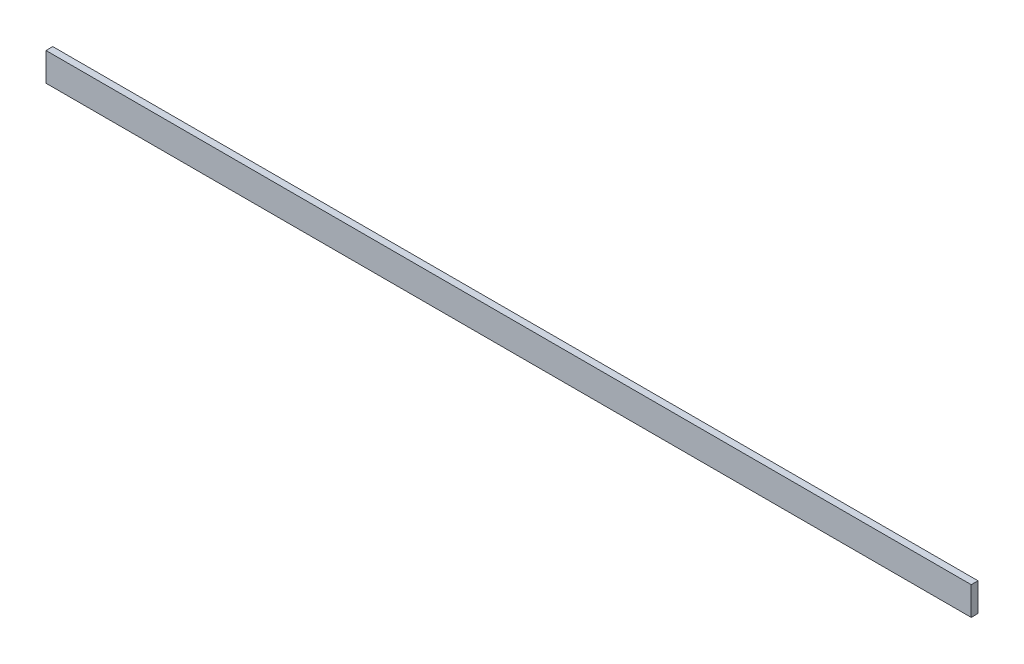
ISO-10303-21;
HEADER;
FILE_DESCRIPTION(('STEP AP214'),'2;1');
FILE_NAME('part.step','',(''),(''),'','','');
FILE_SCHEMA(('AUTOMOTIVE_DESIGN { 1 0 10303 214 1 1 1 1 }'));
ENDSEC;
DATA;
#1=APPLICATION_CONTEXT('core data for automotive mechanical design processes');
#2=APPLICATION_PROTOCOL_DEFINITION('international standard','automotive_design',2000,#1);
#3=PRODUCT_CONTEXT('',#1,'mechanical');
#4=PRODUCT('Part','Part','',(#3));
#5=PRODUCT_RELATED_PRODUCT_CATEGORY('part','',(#4));
#6=PRODUCT_DEFINITION_FORMATION('','',#4);
#7=PRODUCT_DEFINITION_CONTEXT('part definition',#1,'design');
#8=PRODUCT_DEFINITION('design','',#6,#7);
#9=PRODUCT_DEFINITION_SHAPE('','',#8);
#10=(LENGTH_UNIT() NAMED_UNIT(*) SI_UNIT(.MILLI.,.METRE.));
#11=(NAMED_UNIT(*) PLANE_ANGLE_UNIT() SI_UNIT($,.RADIAN.));
#12=(NAMED_UNIT(*) SI_UNIT($,.STERADIAN.) SOLID_ANGLE_UNIT());
#13=UNCERTAINTY_MEASURE_WITH_UNIT(LENGTH_MEASURE(1.E-05),#10,'distance_accuracy_value','');
#14=(GEOMETRIC_REPRESENTATION_CONTEXT(3) GLOBAL_UNCERTAINTY_ASSIGNED_CONTEXT((#13)) GLOBAL_UNIT_ASSIGNED_CONTEXT((#10,
#11,#12)) REPRESENTATION_CONTEXT('',''));
#15=CARTESIAN_POINT('',(0.,0.,0.));
#16=DIRECTION('',(0.,0.,1.));
#17=DIRECTION('',(1.,0.,0.));
#18=AXIS2_PLACEMENT_3D('',#15,#16,#17);
#19=CARTESIAN_POINT('',(3000.,92.,0.));
#20=DIRECTION('',(0.,1.,0.));
#21=DIRECTION('',(1.,0.,0.));
#22=AXIS2_PLACEMENT_3D('',#19,#20,#21);
#23=PLANE('',#22);
#24=DIRECTION('',(-1.,0.,0.));
#25=VECTOR('',#24,1.);
#26=CARTESIAN_POINT('',(3000.,92.,0.));
#27=LINE('',#26,#25);
#28=CARTESIAN_POINT('',(3000.,92.,0.));
#29=VERTEX_POINT('',#28);
#30=CARTESIAN_POINT('',(0.,92.,0.));
#31=VERTEX_POINT('',#30);
#32=EDGE_CURVE('E11',#29,#31,#27,.T.);
#33=ORIENTED_EDGE('',*,*,#32,.T.);
#34=DIRECTION('',(0.,0.,1.));
#35=VECTOR('',#34,1.);
#36=CARTESIAN_POINT('',(0.,92.,0.));
#37=LINE('',#36,#35);
#38=CARTESIAN_POINT('',(0.,92.,22.));
#39=VERTEX_POINT('',#38);
#40=EDGE_CURVE('E27',#31,#39,#37,.T.);
#41=ORIENTED_EDGE('',*,*,#40,.T.);
#42=DIRECTION('',(-1.,0.,0.));
#43=VECTOR('',#42,1.);
#44=CARTESIAN_POINT('',(3000.,92.,22.));
#45=LINE('',#44,#43);
#46=CARTESIAN_POINT('',(3000.,92.,22.));
#47=VERTEX_POINT('',#46);
#48=EDGE_CURVE('E106',#47,#39,#45,.T.);
#49=ORIENTED_EDGE('',*,*,#48,.F.);
#50=DIRECTION('',(0.,0.,1.));
#51=VECTOR('',#50,1.);
#52=CARTESIAN_POINT('',(3000.,92.,0.));
#53=LINE('',#52,#51);
#54=EDGE_CURVE('E90',#29,#47,#53,.T.);
#55=ORIENTED_EDGE('',*,*,#54,.F.);
#56=EDGE_LOOP('',(#33,#41,#49,#55));
#57=FACE_BOUND('',#56,.T.);
#58=ADVANCED_FACE('F16',(#57),#23,.T.);
#59=CARTESIAN_POINT('',(3000.,0.,0.));
#60=DIRECTION('',(1.,0.,0.));
#61=DIRECTION('',(0.,1.,0.));
#62=AXIS2_PLACEMENT_3D('',#59,#60,#61);
#63=PLANE('',#62);
#64=DIRECTION('',(0.,1.,0.));
#65=VECTOR('',#64,1.);
#66=CARTESIAN_POINT('',(3000.,0.,0.));
#67=LINE('',#66,#65);
#68=CARTESIAN_POINT('',(3000.,0.,0.));
#69=VERTEX_POINT('',#68);
#70=EDGE_CURVE('E78',#69,#29,#67,.T.);
#71=ORIENTED_EDGE('',*,*,#70,.T.);
#72=ORIENTED_EDGE('',*,*,#54,.T.);
#73=DIRECTION('',(0.,1.,0.));
#74=VECTOR('',#73,1.);
#75=CARTESIAN_POINT('',(3000.,0.,22.));
#76=LINE('',#75,#74);
#77=CARTESIAN_POINT('',(3000.,0.,22.));
#78=VERTEX_POINT('',#77);
#79=EDGE_CURVE('E80',#78,#47,#76,.T.);
#80=ORIENTED_EDGE('',*,*,#79,.F.);
#81=DIRECTION('',(0.,0.,1.));
#82=VECTOR('',#81,1.);
#83=CARTESIAN_POINT('',(3000.,0.,0.));
#84=LINE('',#83,#82);
#85=EDGE_CURVE('E74',#69,#78,#84,.T.);
#86=ORIENTED_EDGE('',*,*,#85,.F.);
#87=EDGE_LOOP('',(#71,#72,#80,#86));
#88=FACE_BOUND('',#87,.T.);
#89=ADVANCED_FACE('F76',(#88),#63,.T.);
#90=CARTESIAN_POINT('',(0.,0.,0.));
#91=DIRECTION('',(0.,-1.,0.));
#92=DIRECTION('',(0.,0.,-1.));
#93=AXIS2_PLACEMENT_3D('',#90,#91,#92);
#94=PLANE('',#93);
#95=DIRECTION('',(1.,0.,0.));
#96=VECTOR('',#95,1.);
#97=CARTESIAN_POINT('',(0.,0.,0.));
#98=LINE('',#97,#96);
#99=CARTESIAN_POINT('',(0.,0.,0.));
#100=VERTEX_POINT('',#99);
#101=EDGE_CURVE('E83',#100,#69,#98,.T.);
#102=ORIENTED_EDGE('',*,*,#101,.T.);
#103=ORIENTED_EDGE('',*,*,#85,.T.);
#104=DIRECTION('',(1.,0.,0.));
#105=VECTOR('',#104,1.);
#106=CARTESIAN_POINT('',(0.,0.,22.));
#107=LINE('',#106,#105);
#108=CARTESIAN_POINT('',(0.,0.,22.));
#109=VERTEX_POINT('',#108);
#110=EDGE_CURVE('E67',#109,#78,#107,.T.);
#111=ORIENTED_EDGE('',*,*,#110,.F.);
#112=DIRECTION('',(0.,0.,1.));
#113=VECTOR('',#112,1.);
#114=CARTESIAN_POINT('',(0.,0.,0.));
#115=LINE('',#114,#113);
#116=EDGE_CURVE('E93',#100,#109,#115,.T.);
#117=ORIENTED_EDGE('',*,*,#116,.F.);
#118=EDGE_LOOP('',(#102,#103,#111,#117));
#119=FACE_BOUND('',#118,.T.);
#120=ADVANCED_FACE('F92',(#119),#94,.T.);
#121=CARTESIAN_POINT('',(0.,92.,0.));
#122=DIRECTION('',(-1.,0.,0.));
#123=DIRECTION('',(0.,0.,1.));
#124=AXIS2_PLACEMENT_3D('',#121,#122,#123);
#125=PLANE('',#124);
#126=DIRECTION('',(0.,-1.,0.));
#127=VECTOR('',#126,1.);
#128=CARTESIAN_POINT('',(0.,92.,0.));
#129=LINE('',#128,#127);
#130=EDGE_CURVE('E20',#31,#100,#129,.T.);
#131=ORIENTED_EDGE('',*,*,#130,.T.);
#132=ORIENTED_EDGE('',*,*,#116,.T.);
#133=DIRECTION('',(0.,-1.,0.));
#134=VECTOR('',#133,1.);
#135=CARTESIAN_POINT('',(0.,92.,22.));
#136=LINE('',#135,#134);
#137=EDGE_CURVE('E109',#39,#109,#136,.T.);
#138=ORIENTED_EDGE('',*,*,#137,.F.);
#139=ORIENTED_EDGE('',*,*,#40,.F.);
#140=EDGE_LOOP('',(#131,#132,#138,#139));
#141=FACE_BOUND('',#140,.T.);
#142=ADVANCED_FACE('F117',(#141),#125,.T.);
#143=CARTESIAN_POINT('',(1500.,46.,22.));
#144=DIRECTION('',(0.,0.,1.));
#145=DIRECTION('',(1.,0.,0.));
#146=AXIS2_PLACEMENT_3D('',#143,#144,#145);
#147=PLANE('',#146);
#148=ORIENTED_EDGE('',*,*,#137,.T.);
#149=ORIENTED_EDGE('',*,*,#110,.T.);
#150=ORIENTED_EDGE('',*,*,#79,.T.);
#151=ORIENTED_EDGE('',*,*,#48,.T.);
#152=EDGE_LOOP('',(#148,#149,#150,#151));
#153=FACE_BOUND('',#152,.T.);
#154=ADVANCED_FACE('F116',(#153),#147,.T.);
#155=CARTESIAN_POINT('',(1500.,46.,0.));
#156=DIRECTION('',(0.,0.,1.));
#157=DIRECTION('',(1.,0.,0.));
#158=AXIS2_PLACEMENT_3D('',#155,#156,#157);
#159=PLANE('',#158);
#160=ORIENTED_EDGE('',*,*,#130,.F.);
#161=ORIENTED_EDGE('',*,*,#32,.F.);
#162=ORIENTED_EDGE('',*,*,#70,.F.);
#163=ORIENTED_EDGE('',*,*,#101,.F.);
#164=EDGE_LOOP('',(#160,#161,#162,#163));
#165=FACE_BOUND('',#164,.T.);
#166=ADVANCED_FACE('F18',(#165),#159,.F.);
#167=CLOSED_SHELL('',(#58,#89,#120,#142,#154,#166));
#168=MANIFOLD_SOLID_BREP('B1',#167);
#169=ADVANCED_BREP_SHAPE_REPRESENTATION('',(#18,#168),#14);
#170=SHAPE_DEFINITION_REPRESENTATION(#9,#169);
ENDSEC;
END-ISO-10303-21;
